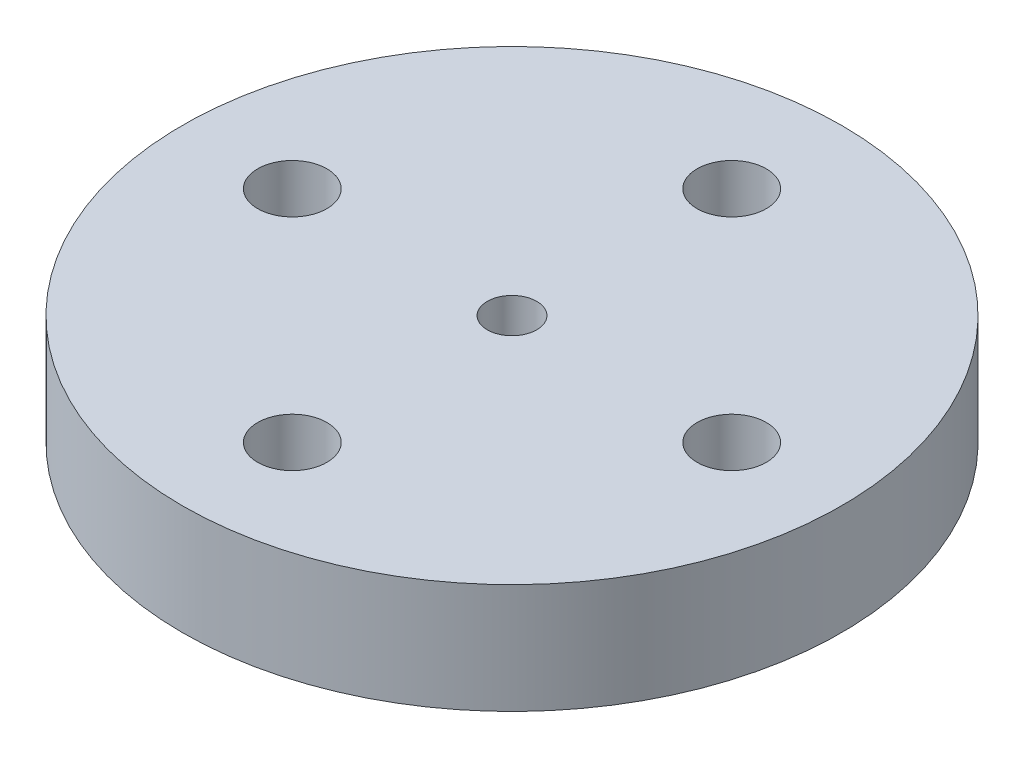
ISO-10303-21;
HEADER;
FILE_DESCRIPTION(('STEP AP214'),'2;1');
FILE_NAME('part.step','',(''),(''),'','','');
FILE_SCHEMA(('AUTOMOTIVE_DESIGN { 1 0 10303 214 1 1 1 1 }'));
ENDSEC;
DATA;
#1=APPLICATION_CONTEXT('core data for automotive mechanical design processes');
#2=APPLICATION_PROTOCOL_DEFINITION('international standard','automotive_design',2000,#1);
#3=PRODUCT_CONTEXT('',#1,'mechanical');
#4=PRODUCT('Part','Part','',(#3));
#5=PRODUCT_RELATED_PRODUCT_CATEGORY('part','',(#4));
#6=PRODUCT_DEFINITION_FORMATION('','',#4);
#7=PRODUCT_DEFINITION_CONTEXT('part definition',#1,'design');
#8=PRODUCT_DEFINITION('design','',#6,#7);
#9=PRODUCT_DEFINITION_SHAPE('','',#8);
#10=(LENGTH_UNIT() NAMED_UNIT(*) SI_UNIT(.MILLI.,.METRE.));
#11=(NAMED_UNIT(*) PLANE_ANGLE_UNIT() SI_UNIT($,.RADIAN.));
#12=(NAMED_UNIT(*) SI_UNIT($,.STERADIAN.) SOLID_ANGLE_UNIT());
#13=UNCERTAINTY_MEASURE_WITH_UNIT(LENGTH_MEASURE(1.E-05),#10,'distance_accuracy_value','');
#14=(GEOMETRIC_REPRESENTATION_CONTEXT(3) GLOBAL_UNCERTAINTY_ASSIGNED_CONTEXT((#13)) GLOBAL_UNIT_ASSIGNED_CONTEXT((#10,
#11,#12)) REPRESENTATION_CONTEXT('',''));
#15=CARTESIAN_POINT('',(0.,0.,0.));
#16=DIRECTION('',(0.,0.,1.));
#17=DIRECTION('',(1.,0.,0.));
#18=AXIS2_PLACEMENT_3D('',#15,#16,#17);
#19=CARTESIAN_POINT('',(0.,10.,0.));
#20=DIRECTION('',(0.,-1.,0.));
#21=DIRECTION('',(0.,0.,-1.));
#22=AXIS2_PLACEMENT_3D('',#19,#20,#21);
#23=CYLINDRICAL_SURFACE('',#22,30.);
#24=CARTESIAN_POINT('',(0.,10.,0.));
#25=DIRECTION('',(0.,1.,0.));
#26=DIRECTION('',(0.,0.,1.));
#27=AXIS2_PLACEMENT_3D('',#24,#25,#26);
#28=CIRCLE('',#27,30.);
#29=CARTESIAN_POINT('',(0.,10.,30.));
#30=VERTEX_POINT('',#29);
#31=EDGE_CURVE('E10',#30,#30,#28,.T.);
#32=ORIENTED_EDGE('',*,*,#31,.F.);
#33=EDGE_LOOP('',(#32));
#34=FACE_BOUND('',#33,.T.);
#35=CARTESIAN_POINT('',(0.,0.,0.));
#36=DIRECTION('',(0.,1.,0.));
#37=DIRECTION('',(0.,0.,1.));
#38=AXIS2_PLACEMENT_3D('',#35,#36,#37);
#39=CIRCLE('',#38,30.);
#40=CARTESIAN_POINT('',(0.,0.,30.));
#41=VERTEX_POINT('',#40);
#42=EDGE_CURVE('E44',#41,#41,#39,.T.);
#43=ORIENTED_EDGE('',*,*,#42,.T.);
#44=EDGE_LOOP('',(#43));
#45=FACE_BOUND('',#44,.T.);
#46=ADVANCED_FACE('F41',(#34,#45),#23,.T.);
#47=CARTESIAN_POINT('',(0.,10.,0.));
#48=DIRECTION('',(0.,1.,0.));
#49=DIRECTION('',(0.,0.,1.));
#50=AXIS2_PLACEMENT_3D('',#47,#48,#49);
#51=PLANE('',#50);
#52=CARTESIAN_POINT('',(0.,10.,0.));
#53=DIRECTION('',(0.,1.,0.));
#54=DIRECTION('',(0.,0.,1.));
#55=AXIS2_PLACEMENT_3D('',#52,#53,#54);
#56=CIRCLE('',#55,2.25);
#57=CARTESIAN_POINT('',(0.,10.,2.25));
#58=VERTEX_POINT('',#57);
#59=EDGE_CURVE('E77',#58,#58,#56,.T.);
#60=ORIENTED_EDGE('',*,*,#59,.F.);
#61=EDGE_LOOP('',(#60));
#62=FACE_BOUND('',#61,.T.);
#63=CARTESIAN_POINT('',(0.,10.,-20.));
#64=DIRECTION('',(0.,1.,0.));
#65=DIRECTION('',(0.,0.,1.));
#66=AXIS2_PLACEMENT_3D('',#63,#64,#65);
#67=CIRCLE('',#66,3.15);
#68=CARTESIAN_POINT('',(0.,10.,-16.85));
#69=VERTEX_POINT('',#68);
#70=EDGE_CURVE('E72',#69,#69,#67,.T.);
#71=ORIENTED_EDGE('',*,*,#70,.F.);
#72=EDGE_LOOP('',(#71));
#73=FACE_BOUND('',#72,.T.);
#74=CARTESIAN_POINT('',(20.,10.,0.));
#75=DIRECTION('',(0.,1.,0.));
#76=DIRECTION('',(0.,0.,1.));
#77=AXIS2_PLACEMENT_3D('',#74,#75,#76);
#78=CIRCLE('',#77,3.15000000000007);
#79=CARTESIAN_POINT('',(20.,10.,3.15000000000007));
#80=VERTEX_POINT('',#79);
#81=EDGE_CURVE('E69',#80,#80,#78,.T.);
#82=ORIENTED_EDGE('',*,*,#81,.F.);
#83=EDGE_LOOP('',(#82));
#84=FACE_BOUND('',#83,.T.);
#85=CARTESIAN_POINT('',(0.,10.,20.));
#86=DIRECTION('',(0.,1.,0.));
#87=DIRECTION('',(0.,0.,1.));
#88=AXIS2_PLACEMENT_3D('',#85,#86,#87);
#89=CIRCLE('',#88,3.15000000000014);
#90=CARTESIAN_POINT('',(0.,10.,23.1500000000001));
#91=VERTEX_POINT('',#90);
#92=EDGE_CURVE('E63',#91,#91,#89,.T.);
#93=ORIENTED_EDGE('',*,*,#92,.F.);
#94=EDGE_LOOP('',(#93));
#95=FACE_BOUND('',#94,.T.);
#96=CARTESIAN_POINT('',(-20.,10.,0.));
#97=DIRECTION('',(0.,1.,0.));
#98=DIRECTION('',(0.,0.,1.));
#99=AXIS2_PLACEMENT_3D('',#96,#97,#98);
#100=CIRCLE('',#99,3.1500000000002);
#101=CARTESIAN_POINT('',(-20.,10.,3.15000000000021));
#102=VERTEX_POINT('',#101);
#103=EDGE_CURVE('E56',#102,#102,#100,.T.);
#104=ORIENTED_EDGE('',*,*,#103,.F.);
#105=EDGE_LOOP('',(#104));
#106=FACE_BOUND('',#105,.T.);
#107=ORIENTED_EDGE('',*,*,#31,.T.);
#108=EDGE_LOOP('',(#107));
#109=FACE_BOUND('',#108,.T.);
#110=ADVANCED_FACE('F93',(#62,#73,#84,#95,#106,#109),#51,.T.);
#111=CARTESIAN_POINT('',(0.,0.,0.));
#112=DIRECTION('',(0.,1.,0.));
#113=DIRECTION('',(0.,0.,1.));
#114=AXIS2_PLACEMENT_3D('',#111,#112,#113);
#115=PLANE('',#114);
#116=CARTESIAN_POINT('',(0.,0.,0.));
#117=DIRECTION('',(0.,1.,0.));
#118=DIRECTION('',(0.,0.,1.));
#119=AXIS2_PLACEMENT_3D('',#116,#117,#118);
#120=CIRCLE('',#119,2.25);
#121=CARTESIAN_POINT('',(0.,0.,2.25));
#122=VERTEX_POINT('',#121);
#123=EDGE_CURVE('E57',#122,#122,#120,.T.);
#124=ORIENTED_EDGE('',*,*,#123,.T.);
#125=EDGE_LOOP('',(#124));
#126=FACE_BOUND('',#125,.T.);
#127=CARTESIAN_POINT('',(0.,0.,-20.));
#128=DIRECTION('',(0.,1.,0.));
#129=DIRECTION('',(0.,0.,1.));
#130=AXIS2_PLACEMENT_3D('',#127,#128,#129);
#131=CIRCLE('',#130,3.15);
#132=CARTESIAN_POINT('',(0.,0.,-16.85));
#133=VERTEX_POINT('',#132);
#134=EDGE_CURVE('E51',#133,#133,#131,.T.);
#135=ORIENTED_EDGE('',*,*,#134,.T.);
#136=EDGE_LOOP('',(#135));
#137=FACE_BOUND('',#136,.T.);
#138=CARTESIAN_POINT('',(20.,0.,0.));
#139=DIRECTION('',(0.,1.,0.));
#140=DIRECTION('',(0.,0.,1.));
#141=AXIS2_PLACEMENT_3D('',#138,#139,#140);
#142=CIRCLE('',#141,3.15000000000007);
#143=CARTESIAN_POINT('',(20.,0.,3.15000000000007));
#144=VERTEX_POINT('',#143);
#145=EDGE_CURVE('E66',#144,#144,#142,.T.);
#146=ORIENTED_EDGE('',*,*,#145,.T.);
#147=EDGE_LOOP('',(#146));
#148=FACE_BOUND('',#147,.T.);
#149=CARTESIAN_POINT('',(0.,0.,20.));
#150=DIRECTION('',(0.,1.,0.));
#151=DIRECTION('',(0.,0.,1.));
#152=AXIS2_PLACEMENT_3D('',#149,#150,#151);
#153=CIRCLE('',#152,3.15000000000014);
#154=CARTESIAN_POINT('',(0.,0.,23.1500000000001));
#155=VERTEX_POINT('',#154);
#156=EDGE_CURVE('E60',#155,#155,#153,.T.);
#157=ORIENTED_EDGE('',*,*,#156,.T.);
#158=EDGE_LOOP('',(#157));
#159=FACE_BOUND('',#158,.T.);
#160=CARTESIAN_POINT('',(-20.,0.,0.));
#161=DIRECTION('',(0.,1.,0.));
#162=DIRECTION('',(0.,0.,1.));
#163=AXIS2_PLACEMENT_3D('',#160,#161,#162);
#164=CIRCLE('',#163,3.1500000000002);
#165=CARTESIAN_POINT('',(-20.,0.,3.15000000000021));
#166=VERTEX_POINT('',#165);
#167=EDGE_CURVE('E53',#166,#166,#164,.T.);
#168=ORIENTED_EDGE('',*,*,#167,.T.);
#169=EDGE_LOOP('',(#168));
#170=FACE_BOUND('',#169,.T.);
#171=ORIENTED_EDGE('',*,*,#42,.F.);
#172=EDGE_LOOP('',(#171));
#173=FACE_BOUND('',#172,.T.);
#174=ADVANCED_FACE('F83',(#126,#137,#148,#159,#170,#173),#115,.F.);
#175=CARTESIAN_POINT('',(-20.,0.,0.));
#176=DIRECTION('',(0.,1.,0.));
#177=DIRECTION('',(0.,0.,1.));
#178=AXIS2_PLACEMENT_3D('',#175,#176,#177);
#179=CYLINDRICAL_SURFACE('',#178,3.1500000000002);
#180=ORIENTED_EDGE('',*,*,#167,.F.);
#181=EDGE_LOOP('',(#180));
#182=FACE_BOUND('',#181,.T.);
#183=ORIENTED_EDGE('',*,*,#103,.T.);
#184=EDGE_LOOP('',(#183));
#185=FACE_BOUND('',#184,.T.);
#186=ADVANCED_FACE('F105',(#182,#185),#179,.F.);
#187=CARTESIAN_POINT('',(0.,0.,20.));
#188=DIRECTION('',(0.,1.,0.));
#189=DIRECTION('',(0.,0.,1.));
#190=AXIS2_PLACEMENT_3D('',#187,#188,#189);
#191=CYLINDRICAL_SURFACE('',#190,3.15000000000014);
#192=ORIENTED_EDGE('',*,*,#156,.F.);
#193=EDGE_LOOP('',(#192));
#194=FACE_BOUND('',#193,.T.);
#195=ORIENTED_EDGE('',*,*,#92,.T.);
#196=EDGE_LOOP('',(#195));
#197=FACE_BOUND('',#196,.T.);
#198=ADVANCED_FACE('F107',(#194,#197),#191,.F.);
#199=CARTESIAN_POINT('',(20.,0.,0.));
#200=DIRECTION('',(0.,1.,0.));
#201=DIRECTION('',(0.,0.,1.));
#202=AXIS2_PLACEMENT_3D('',#199,#200,#201);
#203=CYLINDRICAL_SURFACE('',#202,3.15000000000007);
#204=ORIENTED_EDGE('',*,*,#145,.F.);
#205=EDGE_LOOP('',(#204));
#206=FACE_BOUND('',#205,.T.);
#207=ORIENTED_EDGE('',*,*,#81,.T.);
#208=EDGE_LOOP('',(#207));
#209=FACE_BOUND('',#208,.T.);
#210=ADVANCED_FACE('F114',(#206,#209),#203,.F.);
#211=CARTESIAN_POINT('',(0.,0.,-20.));
#212=DIRECTION('',(0.,1.,0.));
#213=DIRECTION('',(0.,0.,1.));
#214=AXIS2_PLACEMENT_3D('',#211,#212,#213);
#215=CYLINDRICAL_SURFACE('',#214,3.15);
#216=ORIENTED_EDGE('',*,*,#134,.F.);
#217=EDGE_LOOP('',(#216));
#218=FACE_BOUND('',#217,.T.);
#219=ORIENTED_EDGE('',*,*,#70,.T.);
#220=EDGE_LOOP('',(#219));
#221=FACE_BOUND('',#220,.T.);
#222=ADVANCED_FACE('F89',(#218,#221),#215,.F.);
#223=CARTESIAN_POINT('',(0.,0.,0.));
#224=DIRECTION('',(0.,1.,0.));
#225=DIRECTION('',(0.,0.,1.));
#226=AXIS2_PLACEMENT_3D('',#223,#224,#225);
#227=CYLINDRICAL_SURFACE('',#226,2.25);
#228=ORIENTED_EDGE('',*,*,#123,.F.);
#229=EDGE_LOOP('',(#228));
#230=FACE_BOUND('',#229,.T.);
#231=ORIENTED_EDGE('',*,*,#59,.T.);
#232=EDGE_LOOP('',(#231));
#233=FACE_BOUND('',#232,.T.);
#234=ADVANCED_FACE('F86',(#230,#233),#227,.F.);
#235=CLOSED_SHELL('',(#46,#110,#174,#186,#198,#210,#222,#234));
#236=MANIFOLD_SOLID_BREP('B2',#235);
#237=ADVANCED_BREP_SHAPE_REPRESENTATION('',(#18,#236),#14);
#238=SHAPE_DEFINITION_REPRESENTATION(#9,#237);
ENDSEC;
END-ISO-10303-21;
